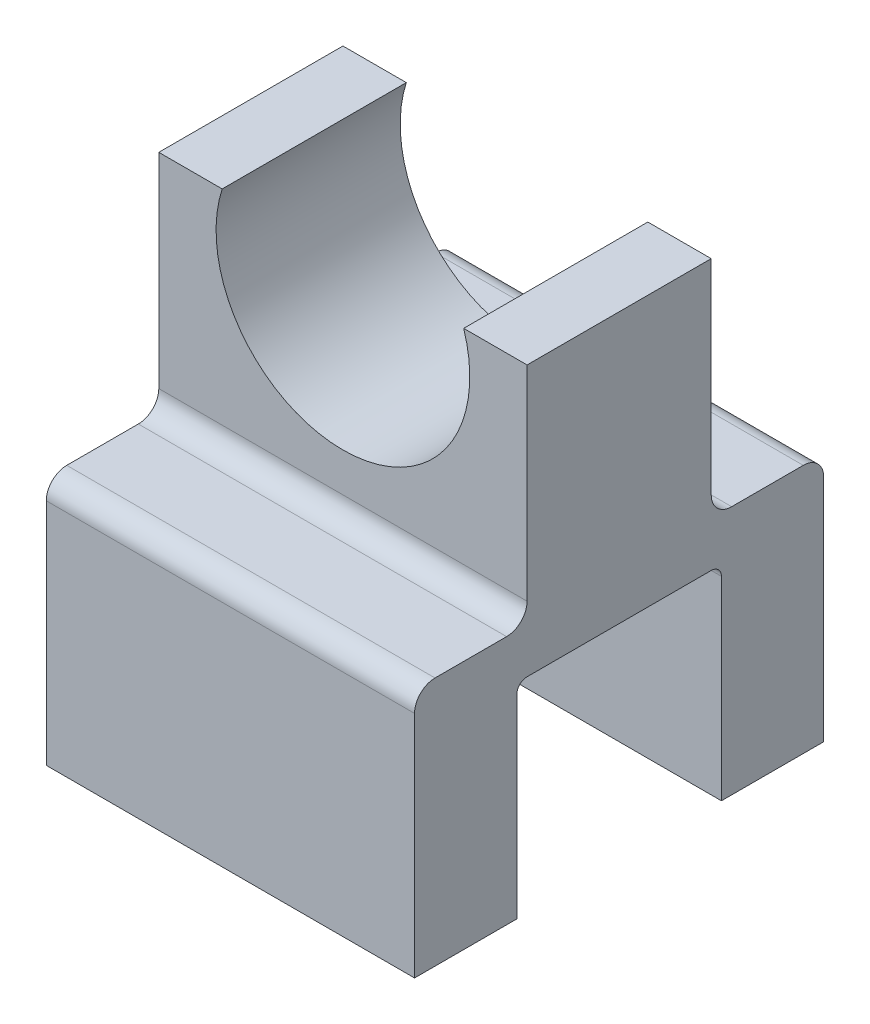
ISO-10303-21;
HEADER;
FILE_DESCRIPTION(('STEP AP214'),'2;1');
FILE_NAME('part.step','',(''),(''),'','','');
FILE_SCHEMA(('AUTOMOTIVE_DESIGN { 1 0 10303 214 1 1 1 1 }'));
ENDSEC;
DATA;
#1=APPLICATION_CONTEXT('core data for automotive mechanical design processes');
#2=APPLICATION_PROTOCOL_DEFINITION('international standard','automotive_design',2000,#1);
#3=PRODUCT_CONTEXT('',#1,'mechanical');
#4=PRODUCT('Part','Part','',(#3));
#5=PRODUCT_RELATED_PRODUCT_CATEGORY('part','',(#4));
#6=PRODUCT_DEFINITION_FORMATION('','',#4);
#7=PRODUCT_DEFINITION_CONTEXT('part definition',#1,'design');
#8=PRODUCT_DEFINITION('design','',#6,#7);
#9=PRODUCT_DEFINITION_SHAPE('','',#8);
#10=(LENGTH_UNIT() NAMED_UNIT(*) SI_UNIT(.MILLI.,.METRE.));
#11=(NAMED_UNIT(*) PLANE_ANGLE_UNIT() SI_UNIT($,.RADIAN.));
#12=(NAMED_UNIT(*) SI_UNIT($,.STERADIAN.) SOLID_ANGLE_UNIT());
#13=UNCERTAINTY_MEASURE_WITH_UNIT(LENGTH_MEASURE(1.E-05),#10,'distance_accuracy_value','');
#14=(GEOMETRIC_REPRESENTATION_CONTEXT(3) GLOBAL_UNCERTAINTY_ASSIGNED_CONTEXT((#13)) GLOBAL_UNIT_ASSIGNED_CONTEXT((#10,
#11,#12)) REPRESENTATION_CONTEXT('',''));
#15=CARTESIAN_POINT('',(0.,0.,0.));
#16=DIRECTION('',(0.,0.,1.));
#17=DIRECTION('',(1.,0.,0.));
#18=AXIS2_PLACEMENT_3D('',#15,#16,#17);
#19=CARTESIAN_POINT('',(0.,0.,50.8));
#20=DIRECTION('',(0.,1.,0.));
#21=DIRECTION('',(0.,0.,1.));
#22=AXIS2_PLACEMENT_3D('',#19,#20,#21);
#23=PLANE('',#22);
#24=DIRECTION('',(0.,0.,-1.));
#25=VECTOR('',#24,1.);
#26=CARTESIAN_POINT('',(0.,0.,50.8));
#27=LINE('',#26,#25);
#28=CARTESIAN_POINT('',(0.,0.,50.8));
#29=VERTEX_POINT('',#28);
#30=CARTESIAN_POINT('',(0.,0.,38.1));
#31=VERTEX_POINT('',#30);
#32=EDGE_CURVE('E216',#29,#31,#27,.T.);
#33=ORIENTED_EDGE('',*,*,#32,.T.);
#34=DIRECTION('',(1.,0.,0.));
#35=VECTOR('',#34,1.);
#36=CARTESIAN_POINT('',(0.,0.,38.1));
#37=LINE('',#36,#35);
#38=CARTESIAN_POINT('',(45.72,0.,38.1));
#39=VERTEX_POINT('',#38);
#40=EDGE_CURVE('E308',#31,#39,#37,.T.);
#41=ORIENTED_EDGE('',*,*,#40,.T.);
#42=DIRECTION('',(0.,0.,-1.));
#43=VECTOR('',#42,1.);
#44=CARTESIAN_POINT('',(45.72,0.,50.8));
#45=LINE('',#44,#43);
#46=CARTESIAN_POINT('',(45.72,0.,50.8));
#47=VERTEX_POINT('',#46);
#48=EDGE_CURVE('E208',#47,#39,#45,.T.);
#49=ORIENTED_EDGE('',*,*,#48,.F.);
#50=DIRECTION('',(1.,0.,0.));
#51=VECTOR('',#50,1.);
#52=CARTESIAN_POINT('',(0.,0.,50.8));
#53=LINE('',#52,#51);
#54=EDGE_CURVE('E322',#29,#47,#53,.T.);
#55=ORIENTED_EDGE('',*,*,#54,.F.);
#56=EDGE_LOOP('',(#33,#41,#49,#55));
#57=FACE_BOUND('',#56,.T.);
#58=ADVANCED_FACE('F42',(#57),#23,.F.);
#59=CARTESIAN_POINT('',(0.,0.,50.8));
#60=DIRECTION('',(1.,0.,0.));
#61=DIRECTION('',(0.,0.,-1.));
#62=AXIS2_PLACEMENT_3D('',#59,#60,#61);
#63=PLANE('',#62);
#64=DIRECTION('',(0.,0.,1.));
#65=VECTOR('',#64,1.);
#66=CARTESIAN_POINT('',(0.,30.988,0.));
#67=LINE('',#66,#65);
#68=CARTESIAN_POINT('',(0.,30.988,2.54));
#69=VERTEX_POINT('',#68);
#70=CARTESIAN_POINT('',(0.,30.988,11.43));
#71=VERTEX_POINT('',#70);
#72=EDGE_CURVE('E271',#69,#71,#67,.T.);
#73=ORIENTED_EDGE('',*,*,#72,.F.);
#74=CARTESIAN_POINT('',(0.,28.448,2.54));
#75=DIRECTION('',(1.,0.,0.));
#76=DIRECTION('',(0.,0.,-1.));
#77=AXIS2_PLACEMENT_3D('',#74,#75,#76);
#78=CIRCLE('',#77,2.54);
#79=CARTESIAN_POINT('',(0.,28.448,0.));
#80=VERTEX_POINT('',#79);
#81=EDGE_CURVE('E244',#69,#80,#78,.F.);
#82=ORIENTED_EDGE('',*,*,#81,.T.);
#83=DIRECTION('',(0.,-1.,0.));
#84=VECTOR('',#83,1.);
#85=CARTESIAN_POINT('',(0.,0.,0.));
#86=LINE('',#85,#84);
#87=CARTESIAN_POINT('',(0.,0.,0.));
#88=VERTEX_POINT('',#87);
#89=EDGE_CURVE('E317',#80,#88,#86,.T.);
#90=ORIENTED_EDGE('',*,*,#89,.T.);
#91=CARTESIAN_POINT('',(0.,0.,12.7));
#92=VERTEX_POINT('',#91);
#93=EDGE_CURVE('E215',#92,#88,#27,.T.);
#94=ORIENTED_EDGE('',*,*,#93,.F.);
#95=DIRECTION('',(0.,1.,0.));
#96=VECTOR('',#95,1.);
#97=CARTESIAN_POINT('',(0.,0.,12.7));
#98=LINE('',#97,#96);
#99=CARTESIAN_POINT('',(0.,24.13,12.7));
#100=VERTEX_POINT('',#99);
#101=EDGE_CURVE('E301',#92,#100,#98,.T.);
#102=ORIENTED_EDGE('',*,*,#101,.T.);
#103=CARTESIAN_POINT('',(0.,24.13,13.97));
#104=DIRECTION('',(1.,0.,0.));
#105=DIRECTION('',(0.,0.,-1.));
#106=AXIS2_PLACEMENT_3D('',#103,#104,#105);
#107=CIRCLE('',#106,1.27);
#108=CARTESIAN_POINT('',(0.,25.4,13.97));
#109=VERTEX_POINT('',#108);
#110=EDGE_CURVE('E235',#100,#109,#107,.T.);
#111=ORIENTED_EDGE('',*,*,#110,.T.);
#112=DIRECTION('',(0.,0.,1.));
#113=VECTOR('',#112,1.);
#114=CARTESIAN_POINT('',(0.,25.4,38.1));
#115=LINE('',#114,#113);
#116=CARTESIAN_POINT('',(0.,25.4,36.83));
#117=VERTEX_POINT('',#116);
#118=EDGE_CURVE('E305',#109,#117,#115,.T.);
#119=ORIENTED_EDGE('',*,*,#118,.T.);
#120=CARTESIAN_POINT('',(0.,24.13,36.83));
#121=DIRECTION('',(1.,0.,0.));
#122=DIRECTION('',(0.,0.,-1.));
#123=AXIS2_PLACEMENT_3D('',#120,#121,#122);
#124=CIRCLE('',#123,1.27);
#125=CARTESIAN_POINT('',(0.,24.13,38.1));
#126=VERTEX_POINT('',#125);
#127=EDGE_CURVE('E231',#117,#126,#124,.T.);
#128=ORIENTED_EDGE('',*,*,#127,.T.);
#129=DIRECTION('',(0.,-1.,0.));
#130=VECTOR('',#129,1.);
#131=CARTESIAN_POINT('',(0.,0.,38.1));
#132=LINE('',#131,#130);
#133=EDGE_CURVE('E299',#126,#31,#132,.T.);
#134=ORIENTED_EDGE('',*,*,#133,.T.);
#135=ORIENTED_EDGE('',*,*,#32,.F.);
#136=DIRECTION('',(0.,-1.,0.));
#137=VECTOR('',#136,1.);
#138=CARTESIAN_POINT('',(0.,0.,50.8));
#139=LINE('',#138,#137);
#140=CARTESIAN_POINT('',(0.,28.448,50.8));
#141=VERTEX_POINT('',#140);
#142=EDGE_CURVE('E320',#141,#29,#139,.T.);
#143=ORIENTED_EDGE('',*,*,#142,.F.);
#144=CARTESIAN_POINT('',(0.,28.448,48.26));
#145=DIRECTION('',(1.,0.,0.));
#146=DIRECTION('',(0.,0.,-1.));
#147=AXIS2_PLACEMENT_3D('',#144,#145,#146);
#148=CIRCLE('',#147,2.54);
#149=CARTESIAN_POINT('',(0.,30.988,48.26));
#150=VERTEX_POINT('',#149);
#151=EDGE_CURVE('E242',#141,#150,#148,.F.);
#152=ORIENTED_EDGE('',*,*,#151,.T.);
#153=DIRECTION('',(0.,0.,1.));
#154=VECTOR('',#153,1.);
#155=CARTESIAN_POINT('',(0.,30.988,50.8));
#156=LINE('',#155,#154);
#157=CARTESIAN_POINT('',(0.,30.988,39.37));
#158=VERTEX_POINT('',#157);
#159=EDGE_CURVE('E189',#158,#150,#156,.T.);
#160=ORIENTED_EDGE('',*,*,#159,.F.);
#161=CARTESIAN_POINT('',(0.,33.528,39.37));
#162=DIRECTION('',(1.,0.,0.));
#163=DIRECTION('',(0.,0.,-1.));
#164=AXIS2_PLACEMENT_3D('',#161,#162,#163);
#165=CIRCLE('',#164,2.54);
#166=CARTESIAN_POINT('',(0.,33.528,36.83));
#167=VERTEX_POINT('',#166);
#168=EDGE_CURVE('E263',#158,#167,#165,.T.);
#169=ORIENTED_EDGE('',*,*,#168,.T.);
#170=DIRECTION('',(0.,-1.,0.));
#171=VECTOR('',#170,1.);
#172=CARTESIAN_POINT('',(0.,58.928,36.83));
#173=LINE('',#172,#171);
#174=CARTESIAN_POINT('',(0.,58.928,36.83));
#175=VERTEX_POINT('',#174);
#176=EDGE_CURVE('E281',#175,#167,#173,.T.);
#177=ORIENTED_EDGE('',*,*,#176,.F.);
#178=DIRECTION('',(0.,0.,-1.));
#179=VECTOR('',#178,1.);
#180=CARTESIAN_POINT('',(0.,58.928,50.8));
#181=LINE('',#180,#179);
#182=CARTESIAN_POINT('',(0.,58.928,13.97));
#183=VERTEX_POINT('',#182);
#184=EDGE_CURVE('E327',#175,#183,#181,.T.);
#185=ORIENTED_EDGE('',*,*,#184,.T.);
#186=DIRECTION('',(0.,1.,0.));
#187=VECTOR('',#186,1.);
#188=CARTESIAN_POINT('',(0.,58.928,13.97));
#189=LINE('',#188,#187);
#190=CARTESIAN_POINT('',(0.,33.528,13.97));
#191=VERTEX_POINT('',#190);
#192=EDGE_CURVE('E273',#191,#183,#189,.T.);
#193=ORIENTED_EDGE('',*,*,#192,.F.);
#194=CARTESIAN_POINT('',(0.,33.528,11.43));
#195=DIRECTION('',(1.,0.,0.));
#196=DIRECTION('',(0.,0.,-1.));
#197=AXIS2_PLACEMENT_3D('',#194,#195,#196);
#198=CIRCLE('',#197,2.54);
#199=EDGE_CURVE('E50',#191,#71,#198,.T.);
#200=ORIENTED_EDGE('',*,*,#199,.T.);
#201=EDGE_LOOP('',(#73,#82,#90,#94,#102,#111,#119,#128,#134,#135,#143,#152,#160,#169,#177,#185,
#193,#200));
#202=FACE_BOUND('',#201,.T.);
#203=ADVANCED_FACE('F270',(#202),#63,.F.);
#204=CARTESIAN_POINT('',(45.72,0.,12.7));
#205=VERTEX_POINT('',#204);
#206=CARTESIAN_POINT('',(45.72,0.,0.));
#207=VERTEX_POINT('',#206);
#208=EDGE_CURVE('E206',#205,#207,#45,.T.);
#209=ORIENTED_EDGE('',*,*,#208,.F.);
#210=DIRECTION('',(1.,0.,0.));
#211=VECTOR('',#210,1.);
#212=CARTESIAN_POINT('',(0.,0.,12.7));
#213=LINE('',#212,#211);
#214=EDGE_CURVE('E315',#92,#205,#213,.T.);
#215=ORIENTED_EDGE('',*,*,#214,.F.);
#216=ORIENTED_EDGE('',*,*,#93,.T.);
#217=DIRECTION('',(1.,0.,0.));
#218=VECTOR('',#217,1.);
#219=CARTESIAN_POINT('',(0.,0.,0.));
#220=LINE('',#219,#218);
#221=EDGE_CURVE('E329',#88,#207,#220,.T.);
#222=ORIENTED_EDGE('',*,*,#221,.T.);
#223=EDGE_LOOP('',(#209,#215,#216,#222));
#224=FACE_BOUND('',#223,.T.);
#225=ADVANCED_FACE('F391',(#224),#23,.F.);
#226=CARTESIAN_POINT('',(45.72,0.,50.8));
#227=DIRECTION('',(-1.,0.,0.));
#228=DIRECTION('',(0.,0.,1.));
#229=AXIS2_PLACEMENT_3D('',#226,#227,#228);
#230=PLANE('',#229);
#231=DIRECTION('',(0.,1.,0.));
#232=VECTOR('',#231,1.);
#233=CARTESIAN_POINT('',(45.72,0.,0.));
#234=LINE('',#233,#232);
#235=CARTESIAN_POINT('',(45.72,28.448,0.));
#236=VERTEX_POINT('',#235);
#237=EDGE_CURVE('E323',#207,#236,#234,.T.);
#238=ORIENTED_EDGE('',*,*,#237,.T.);
#239=CARTESIAN_POINT('',(45.72,28.448,2.54));
#240=DIRECTION('',(-1.,0.,0.));
#241=DIRECTION('',(0.,0.,1.));
#242=AXIS2_PLACEMENT_3D('',#239,#240,#241);
#243=CIRCLE('',#242,2.54);
#244=CARTESIAN_POINT('',(45.72,30.988,2.54));
#245=VERTEX_POINT('',#244);
#246=EDGE_CURVE('E249',#236,#245,#243,.F.);
#247=ORIENTED_EDGE('',*,*,#246,.T.);
#248=DIRECTION('',(0.,0.,1.));
#249=VECTOR('',#248,1.);
#250=CARTESIAN_POINT('',(45.72,30.988,0.));
#251=LINE('',#250,#249);
#252=CARTESIAN_POINT('',(45.72,30.988,11.43));
#253=VERTEX_POINT('',#252);
#254=EDGE_CURVE('E287',#245,#253,#251,.T.);
#255=ORIENTED_EDGE('',*,*,#254,.T.);
#256=CARTESIAN_POINT('',(45.72,33.528,11.43));
#257=DIRECTION('',(-1.,0.,0.));
#258=DIRECTION('',(0.,0.,1.));
#259=AXIS2_PLACEMENT_3D('',#256,#257,#258);
#260=CIRCLE('',#259,2.54);
#261=CARTESIAN_POINT('',(45.72,33.528,13.97));
#262=VERTEX_POINT('',#261);
#263=EDGE_CURVE('E11',#253,#262,#260,.T.);
#264=ORIENTED_EDGE('',*,*,#263,.T.);
#265=DIRECTION('',(0.,1.,0.));
#266=VECTOR('',#265,1.);
#267=CARTESIAN_POINT('',(45.72,58.928,13.97));
#268=LINE('',#267,#266);
#269=CARTESIAN_POINT('',(45.72,58.928,13.97));
#270=VERTEX_POINT('',#269);
#271=EDGE_CURVE('E204',#262,#270,#268,.T.);
#272=ORIENTED_EDGE('',*,*,#271,.T.);
#273=DIRECTION('',(0.,0.,-1.));
#274=VECTOR('',#273,1.);
#275=CARTESIAN_POINT('',(45.72,58.928,50.8));
#276=LINE('',#275,#274);
#277=CARTESIAN_POINT('',(45.72,58.928,36.83));
#278=VERTEX_POINT('',#277);
#279=EDGE_CURVE('E196',#278,#270,#276,.T.);
#280=ORIENTED_EDGE('',*,*,#279,.F.);
#281=DIRECTION('',(0.,-1.,0.));
#282=VECTOR('',#281,1.);
#283=CARTESIAN_POINT('',(45.72,58.928,36.83));
#284=LINE('',#283,#282);
#285=CARTESIAN_POINT('',(45.72,33.528,36.83));
#286=VERTEX_POINT('',#285);
#287=EDGE_CURVE('E178',#278,#286,#284,.T.);
#288=ORIENTED_EDGE('',*,*,#287,.T.);
#289=CARTESIAN_POINT('',(45.72,33.528,39.37));
#290=DIRECTION('',(-1.,0.,0.));
#291=DIRECTION('',(0.,0.,1.));
#292=AXIS2_PLACEMENT_3D('',#289,#290,#291);
#293=CIRCLE('',#292,2.54);
#294=CARTESIAN_POINT('',(45.72,30.988,39.37));
#295=VERTEX_POINT('',#294);
#296=EDGE_CURVE('E265',#286,#295,#293,.T.);
#297=ORIENTED_EDGE('',*,*,#296,.T.);
#298=DIRECTION('',(0.,0.,1.));
#299=VECTOR('',#298,1.);
#300=CARTESIAN_POINT('',(45.72,30.988,50.8));
#301=LINE('',#300,#299);
#302=CARTESIAN_POINT('',(45.72,30.988,48.26));
#303=VERTEX_POINT('',#302);
#304=EDGE_CURVE('E188',#295,#303,#301,.T.);
#305=ORIENTED_EDGE('',*,*,#304,.T.);
#306=CARTESIAN_POINT('',(45.72,28.448,48.26));
#307=DIRECTION('',(-1.,0.,0.));
#308=DIRECTION('',(0.,0.,1.));
#309=AXIS2_PLACEMENT_3D('',#306,#307,#308);
#310=CIRCLE('',#309,2.54);
#311=CARTESIAN_POINT('',(45.72,28.448,50.8));
#312=VERTEX_POINT('',#311);
#313=EDGE_CURVE('E62',#303,#312,#310,.F.);
#314=ORIENTED_EDGE('',*,*,#313,.T.);
#315=DIRECTION('',(0.,1.,0.));
#316=VECTOR('',#315,1.);
#317=CARTESIAN_POINT('',(45.72,0.,50.8));
#318=LINE('',#317,#316);
#319=EDGE_CURVE('E325',#47,#312,#318,.T.);
#320=ORIENTED_EDGE('',*,*,#319,.F.);
#321=ORIENTED_EDGE('',*,*,#48,.T.);
#322=DIRECTION('',(0.,-1.,0.));
#323=VECTOR('',#322,1.);
#324=CARTESIAN_POINT('',(45.72,0.,38.1));
#325=LINE('',#324,#323);
#326=CARTESIAN_POINT('',(45.72,24.13,38.1));
#327=VERTEX_POINT('',#326);
#328=EDGE_CURVE('E298',#327,#39,#325,.T.);
#329=ORIENTED_EDGE('',*,*,#328,.F.);
#330=CARTESIAN_POINT('',(45.72,24.13,36.83));
#331=DIRECTION('',(-1.,0.,0.));
#332=DIRECTION('',(0.,0.,1.));
#333=AXIS2_PLACEMENT_3D('',#330,#331,#332);
#334=CIRCLE('',#333,1.27);
#335=CARTESIAN_POINT('',(45.72,25.4,36.83));
#336=VERTEX_POINT('',#335);
#337=EDGE_CURVE('E229',#327,#336,#334,.T.);
#338=ORIENTED_EDGE('',*,*,#337,.T.);
#339=DIRECTION('',(0.,0.,1.));
#340=VECTOR('',#339,1.);
#341=CARTESIAN_POINT('',(45.72,25.4,38.1));
#342=LINE('',#341,#340);
#343=CARTESIAN_POINT('',(45.72,25.4,13.97));
#344=VERTEX_POINT('',#343);
#345=EDGE_CURVE('E302',#344,#336,#342,.T.);
#346=ORIENTED_EDGE('',*,*,#345,.F.);
#347=CARTESIAN_POINT('',(45.72,24.13,13.97));
#348=DIRECTION('',(-1.,0.,0.));
#349=DIRECTION('',(0.,0.,1.));
#350=AXIS2_PLACEMENT_3D('',#347,#348,#349);
#351=CIRCLE('',#350,1.27);
#352=CARTESIAN_POINT('',(45.72,24.13,12.7));
#353=VERTEX_POINT('',#352);
#354=EDGE_CURVE('E233',#344,#353,#351,.T.);
#355=ORIENTED_EDGE('',*,*,#354,.T.);
#356=DIRECTION('',(0.,1.,0.));
#357=VECTOR('',#356,1.);
#358=CARTESIAN_POINT('',(45.72,0.,12.7));
#359=LINE('',#358,#357);
#360=EDGE_CURVE('E310',#205,#353,#359,.T.);
#361=ORIENTED_EDGE('',*,*,#360,.F.);
#362=ORIENTED_EDGE('',*,*,#208,.T.);
#363=EDGE_LOOP('',(#238,#247,#255,#264,#272,#280,#288,#297,#305,#314,#320,#321,#329,#338,#346,
#355,#361,#362));
#364=FACE_BOUND('',#363,.T.);
#365=ADVANCED_FACE('F203',(#364),#230,.F.);
#366=CARTESIAN_POINT('',(37.8503044665544,58.928,50.8));
#367=DIRECTION('',(0.,-1.,0.));
#368=DIRECTION('',(1.,0.,0.));
#369=AXIS2_PLACEMENT_3D('',#366,#367,#368);
#370=PLANE('',#369);
#371=DIRECTION('',(0.,0.,-1.));
#372=VECTOR('',#371,1.);
#373=CARTESIAN_POINT('',(37.8503044665544,58.928,50.8));
#374=LINE('',#373,#372);
#375=CARTESIAN_POINT('',(37.8503044665544,58.928,36.83));
#376=VERTEX_POINT('',#375);
#377=CARTESIAN_POINT('',(37.8503044665544,58.928,13.97));
#378=VERTEX_POINT('',#377);
#379=EDGE_CURVE('E198',#376,#378,#374,.T.);
#380=ORIENTED_EDGE('',*,*,#379,.F.);
#381=DIRECTION('',(-1.,0.,0.));
#382=VECTOR('',#381,1.);
#383=CARTESIAN_POINT('',(45.72,58.928,36.83));
#384=LINE('',#383,#382);
#385=EDGE_CURVE('E182',#278,#376,#384,.T.);
#386=ORIENTED_EDGE('',*,*,#385,.F.);
#387=ORIENTED_EDGE('',*,*,#279,.T.);
#388=DIRECTION('',(-1.,0.,0.));
#389=VECTOR('',#388,1.);
#390=CARTESIAN_POINT('',(45.72,58.928,13.97));
#391=LINE('',#390,#389);
#392=EDGE_CURVE('E286',#270,#378,#391,.T.);
#393=ORIENTED_EDGE('',*,*,#392,.T.);
#394=EDGE_LOOP('',(#380,#386,#387,#393));
#395=FACE_BOUND('',#394,.T.);
#396=ADVANCED_FACE('F194',(#395),#370,.F.);
#397=CARTESIAN_POINT('',(22.86,54.102,50.8));
#398=DIRECTION('',(0.,0.,-1.));
#399=DIRECTION('',(-1.,0.,0.));
#400=AXIS2_PLACEMENT_3D('',#397,#398,#399);
#401=CYLINDRICAL_SURFACE('',#400,15.748);
#402=DIRECTION('',(0.,0.,-1.));
#403=VECTOR('',#402,1.);
#404=CARTESIAN_POINT('',(7.86969553344563,58.928,50.8));
#405=LINE('',#404,#403);
#406=CARTESIAN_POINT('',(7.86969553344563,58.928,36.83));
#407=VERTEX_POINT('',#406);
#408=CARTESIAN_POINT('',(7.86969553344563,58.928,13.97));
#409=VERTEX_POINT('',#408);
#410=EDGE_CURVE('E210',#407,#409,#405,.T.);
#411=ORIENTED_EDGE('',*,*,#410,.F.);
#412=CARTESIAN_POINT('',(22.86,54.102,36.83));
#413=DIRECTION('',(0.,0.,-1.));
#414=DIRECTION('',(-1.,0.,0.));
#415=AXIS2_PLACEMENT_3D('',#412,#413,#414);
#416=CIRCLE('',#415,15.748);
#417=EDGE_CURVE('E296',#407,#376,#416,.F.);
#418=ORIENTED_EDGE('',*,*,#417,.T.);
#419=ORIENTED_EDGE('',*,*,#379,.T.);
#420=CARTESIAN_POINT('',(22.86,54.102,13.97));
#421=DIRECTION('',(0.,0.,1.));
#422=DIRECTION('',(0.,-1.,0.));
#423=AXIS2_PLACEMENT_3D('',#420,#421,#422);
#424=CIRCLE('',#423,15.748);
#425=EDGE_CURVE('E199',#378,#409,#424,.F.);
#426=ORIENTED_EDGE('',*,*,#425,.T.);
#427=EDGE_LOOP('',(#411,#418,#419,#426));
#428=FACE_BOUND('',#427,.T.);
#429=ADVANCED_FACE('F340',(#428),#401,.F.);
#430=CARTESIAN_POINT('',(0.,58.928,50.8));
#431=DIRECTION('',(0.,-1.,0.));
#432=DIRECTION('',(1.,0.,0.));
#433=AXIS2_PLACEMENT_3D('',#430,#431,#432);
#434=PLANE('',#433);
#435=ORIENTED_EDGE('',*,*,#184,.F.);
#436=EDGE_CURVE('E200',#407,#175,#384,.T.);
#437=ORIENTED_EDGE('',*,*,#436,.F.);
#438=ORIENTED_EDGE('',*,*,#410,.T.);
#439=EDGE_CURVE('E290',#409,#183,#391,.T.);
#440=ORIENTED_EDGE('',*,*,#439,.T.);
#441=EDGE_LOOP('',(#435,#437,#438,#440));
#442=FACE_BOUND('',#441,.T.);
#443=ADVANCED_FACE('F338',(#442),#434,.F.);
#444=CARTESIAN_POINT('',(22.86,54.102,50.8));
#445=DIRECTION('',(0.,0.,1.));
#446=DIRECTION('',(1.,0.,0.));
#447=AXIS2_PLACEMENT_3D('',#444,#445,#446);
#448=PLANE('',#447);
#449=ORIENTED_EDGE('',*,*,#319,.T.);
#450=DIRECTION('',(-1.,0.,0.));
#451=VECTOR('',#450,1.);
#452=CARTESIAN_POINT('',(0.,28.448,50.8));
#453=LINE('',#452,#451);
#454=EDGE_CURVE('E251',#312,#141,#453,.T.);
#455=ORIENTED_EDGE('',*,*,#454,.T.);
#456=ORIENTED_EDGE('',*,*,#142,.T.);
#457=ORIENTED_EDGE('',*,*,#54,.T.);
#458=EDGE_LOOP('',(#449,#455,#456,#457));
#459=FACE_BOUND('',#458,.T.);
#460=ADVANCED_FACE('F359',(#459),#448,.T.);
#461=CARTESIAN_POINT('',(22.86,54.102,0.));
#462=DIRECTION('',(0.,0.,1.));
#463=DIRECTION('',(1.,0.,0.));
#464=AXIS2_PLACEMENT_3D('',#461,#462,#463);
#465=PLANE('',#464);
#466=ORIENTED_EDGE('',*,*,#89,.F.);
#467=DIRECTION('',(-1.,0.,0.));
#468=VECTOR('',#467,1.);
#469=CARTESIAN_POINT('',(22.86,28.448,0.));
#470=LINE('',#469,#468);
#471=EDGE_CURVE('E246',#80,#236,#470,.F.);
#472=ORIENTED_EDGE('',*,*,#471,.T.);
#473=ORIENTED_EDGE('',*,*,#237,.F.);
#474=ORIENTED_EDGE('',*,*,#221,.F.);
#475=EDGE_LOOP('',(#466,#472,#473,#474));
#476=FACE_BOUND('',#475,.T.);
#477=ADVANCED_FACE('F396',(#476),#465,.F.);
#478=CARTESIAN_POINT('',(0.,0.,38.1));
#479=DIRECTION('',(0.,0.,1.));
#480=DIRECTION('',(1.,0.,0.));
#481=AXIS2_PLACEMENT_3D('',#478,#479,#480);
#482=PLANE('',#481);
#483=ORIENTED_EDGE('',*,*,#133,.F.);
#484=DIRECTION('',(1.,0.,0.));
#485=VECTOR('',#484,1.);
#486=CARTESIAN_POINT('',(45.72,24.13,38.1));
#487=LINE('',#486,#485);
#488=EDGE_CURVE('E219',#126,#327,#487,.T.);
#489=ORIENTED_EDGE('',*,*,#488,.T.);
#490=ORIENTED_EDGE('',*,*,#328,.T.);
#491=ORIENTED_EDGE('',*,*,#40,.F.);
#492=EDGE_LOOP('',(#483,#489,#490,#491));
#493=FACE_BOUND('',#492,.T.);
#494=ADVANCED_FACE('F369',(#493),#482,.F.);
#495=CARTESIAN_POINT('',(0.,25.4,38.1));
#496=DIRECTION('',(0.,1.,0.));
#497=DIRECTION('',(0.,0.,1.));
#498=AXIS2_PLACEMENT_3D('',#495,#496,#497);
#499=PLANE('',#498);
#500=ORIENTED_EDGE('',*,*,#345,.T.);
#501=DIRECTION('',(1.,0.,0.));
#502=VECTOR('',#501,1.);
#503=CARTESIAN_POINT('',(0.,25.4,36.83));
#504=LINE('',#503,#502);
#505=EDGE_CURVE('E225',#336,#117,#504,.F.);
#506=ORIENTED_EDGE('',*,*,#505,.T.);
#507=ORIENTED_EDGE('',*,*,#118,.F.);
#508=DIRECTION('',(1.,0.,0.));
#509=VECTOR('',#508,1.);
#510=CARTESIAN_POINT('',(45.72,25.4,13.97));
#511=LINE('',#510,#509);
#512=EDGE_CURVE('E222',#109,#344,#511,.T.);
#513=ORIENTED_EDGE('',*,*,#512,.T.);
#514=EDGE_LOOP('',(#500,#506,#507,#513));
#515=FACE_BOUND('',#514,.T.);
#516=ADVANCED_FACE('F377',(#515),#499,.F.);
#517=CARTESIAN_POINT('',(0.,0.,12.7));
#518=DIRECTION('',(0.,0.,-1.));
#519=DIRECTION('',(-1.,0.,0.));
#520=AXIS2_PLACEMENT_3D('',#517,#518,#519);
#521=PLANE('',#520);
#522=ORIENTED_EDGE('',*,*,#360,.T.);
#523=DIRECTION('',(1.,0.,0.));
#524=VECTOR('',#523,1.);
#525=CARTESIAN_POINT('',(0.,24.13,12.7));
#526=LINE('',#525,#524);
#527=EDGE_CURVE('E227',#353,#100,#526,.F.);
#528=ORIENTED_EDGE('',*,*,#527,.T.);
#529=ORIENTED_EDGE('',*,*,#101,.F.);
#530=ORIENTED_EDGE('',*,*,#214,.T.);
#531=EDGE_LOOP('',(#522,#528,#529,#530));
#532=FACE_BOUND('',#531,.T.);
#533=ADVANCED_FACE('F387',(#532),#521,.F.);
#534=CARTESIAN_POINT('',(0.,24.13,36.83));
#535=DIRECTION('',(-1.,0.,0.));
#536=DIRECTION('',(0.,0.,1.));
#537=AXIS2_PLACEMENT_3D('',#534,#535,#536);
#538=CYLINDRICAL_SURFACE('',#537,1.27);
#539=ORIENTED_EDGE('',*,*,#127,.F.);
#540=ORIENTED_EDGE('',*,*,#505,.F.);
#541=ORIENTED_EDGE('',*,*,#337,.F.);
#542=ORIENTED_EDGE('',*,*,#488,.F.);
#543=EDGE_LOOP('',(#539,#540,#541,#542));
#544=FACE_BOUND('',#543,.T.);
#545=ADVANCED_FACE('F373',(#544),#538,.F.);
#546=CARTESIAN_POINT('',(0.,24.13,13.97));
#547=DIRECTION('',(-1.,0.,0.));
#548=DIRECTION('',(0.,0.,1.));
#549=AXIS2_PLACEMENT_3D('',#546,#547,#548);
#550=CYLINDRICAL_SURFACE('',#549,1.27);
#551=ORIENTED_EDGE('',*,*,#110,.F.);
#552=ORIENTED_EDGE('',*,*,#527,.F.);
#553=ORIENTED_EDGE('',*,*,#354,.F.);
#554=ORIENTED_EDGE('',*,*,#512,.F.);
#555=EDGE_LOOP('',(#551,#552,#553,#554));
#556=FACE_BOUND('',#555,.T.);
#557=ADVANCED_FACE('F383',(#556),#550,.F.);
#558=CARTESIAN_POINT('',(45.72,58.928,13.97));
#559=DIRECTION('',(0.,0.,1.));
#560=DIRECTION('',(0.,-1.,0.));
#561=AXIS2_PLACEMENT_3D('',#558,#559,#560);
#562=PLANE('',#561);
#563=ORIENTED_EDGE('',*,*,#271,.F.);
#564=DIRECTION('',(-1.,0.,0.));
#565=VECTOR('',#564,1.);
#566=CARTESIAN_POINT('',(0.,33.528,13.97));
#567=LINE('',#566,#565);
#568=EDGE_CURVE('E260',#262,#191,#567,.T.);
#569=ORIENTED_EDGE('',*,*,#568,.T.);
#570=ORIENTED_EDGE('',*,*,#192,.T.);
#571=ORIENTED_EDGE('',*,*,#439,.F.);
#572=ORIENTED_EDGE('',*,*,#425,.F.);
#573=ORIENTED_EDGE('',*,*,#392,.F.);
#574=EDGE_LOOP('',(#563,#569,#570,#571,#572,#573));
#575=FACE_BOUND('',#574,.T.);
#576=ADVANCED_FACE('F284',(#575),#562,.F.);
#577=CARTESIAN_POINT('',(45.72,30.988,0.));
#578=DIRECTION('',(0.,-1.,0.));
#579=DIRECTION('',(0.,0.,-1.));
#580=AXIS2_PLACEMENT_3D('',#577,#578,#579);
#581=PLANE('',#580);
#582=ORIENTED_EDGE('',*,*,#254,.F.);
#583=DIRECTION('',(-1.,0.,0.));
#584=VECTOR('',#583,1.);
#585=CARTESIAN_POINT('',(45.72,30.988,2.54));
#586=LINE('',#585,#584);
#587=EDGE_CURVE('E239',#245,#69,#586,.T.);
#588=ORIENTED_EDGE('',*,*,#587,.T.);
#589=ORIENTED_EDGE('',*,*,#72,.T.);
#590=DIRECTION('',(-1.,0.,0.));
#591=VECTOR('',#590,1.);
#592=CARTESIAN_POINT('',(45.72,30.988,11.43));
#593=LINE('',#592,#591);
#594=EDGE_CURVE('E237',#71,#253,#593,.F.);
#595=ORIENTED_EDGE('',*,*,#594,.T.);
#596=EDGE_LOOP('',(#582,#588,#589,#595));
#597=FACE_BOUND('',#596,.T.);
#598=ADVANCED_FACE('F279',(#597),#581,.F.);
#599=CARTESIAN_POINT('',(45.72,58.928,36.83));
#600=DIRECTION('',(0.,0.,-1.));
#601=DIRECTION('',(-1.,0.,0.));
#602=AXIS2_PLACEMENT_3D('',#599,#600,#601);
#603=PLANE('',#602);
#604=ORIENTED_EDGE('',*,*,#176,.T.);
#605=DIRECTION('',(-1.,0.,0.));
#606=VECTOR('',#605,1.);
#607=CARTESIAN_POINT('',(45.72,33.528,36.83));
#608=LINE('',#607,#606);
#609=EDGE_CURVE('E185',#167,#286,#608,.F.);
#610=ORIENTED_EDGE('',*,*,#609,.T.);
#611=ORIENTED_EDGE('',*,*,#287,.F.);
#612=ORIENTED_EDGE('',*,*,#385,.T.);
#613=ORIENTED_EDGE('',*,*,#417,.F.);
#614=ORIENTED_EDGE('',*,*,#436,.T.);
#615=EDGE_LOOP('',(#604,#610,#611,#612,#613,#614));
#616=FACE_BOUND('',#615,.T.);
#617=ADVANCED_FACE('F181',(#616),#603,.F.);
#618=CARTESIAN_POINT('',(45.72,30.988,50.8));
#619=DIRECTION('',(0.,-1.,0.));
#620=DIRECTION('',(0.,0.,-1.));
#621=AXIS2_PLACEMENT_3D('',#618,#619,#620);
#622=PLANE('',#621);
#623=ORIENTED_EDGE('',*,*,#159,.T.);
#624=DIRECTION('',(-1.,0.,0.));
#625=VECTOR('',#624,1.);
#626=CARTESIAN_POINT('',(45.72,30.988,48.26));
#627=LINE('',#626,#625);
#628=EDGE_CURVE('E257',#150,#303,#627,.F.);
#629=ORIENTED_EDGE('',*,*,#628,.T.);
#630=ORIENTED_EDGE('',*,*,#304,.F.);
#631=DIRECTION('',(-1.,0.,0.));
#632=VECTOR('',#631,1.);
#633=CARTESIAN_POINT('',(0.,30.988,39.37));
#634=LINE('',#633,#632);
#635=EDGE_CURVE('E254',#295,#158,#634,.T.);
#636=ORIENTED_EDGE('',*,*,#635,.T.);
#637=EDGE_LOOP('',(#623,#629,#630,#636));
#638=FACE_BOUND('',#637,.T.);
#639=ADVANCED_FACE('F352',(#638),#622,.F.);
#640=CARTESIAN_POINT('',(45.72,28.448,2.54));
#641=DIRECTION('',(-1.,0.,0.));
#642=DIRECTION('',(0.,0.,1.));
#643=AXIS2_PLACEMENT_3D('',#640,#641,#642);
#644=CYLINDRICAL_SURFACE('',#643,2.54);
#645=ORIENTED_EDGE('',*,*,#246,.F.);
#646=ORIENTED_EDGE('',*,*,#471,.F.);
#647=ORIENTED_EDGE('',*,*,#81,.F.);
#648=ORIENTED_EDGE('',*,*,#587,.F.);
#649=EDGE_LOOP('',(#645,#646,#647,#648));
#650=FACE_BOUND('',#649,.T.);
#651=ADVANCED_FACE('F400',(#650),#644,.T.);
#652=CARTESIAN_POINT('',(22.86,28.448,48.26));
#653=DIRECTION('',(1.,0.,0.));
#654=DIRECTION('',(0.,0.,-1.));
#655=AXIS2_PLACEMENT_3D('',#652,#653,#654);
#656=CYLINDRICAL_SURFACE('',#655,2.54);
#657=ORIENTED_EDGE('',*,*,#313,.F.);
#658=ORIENTED_EDGE('',*,*,#628,.F.);
#659=ORIENTED_EDGE('',*,*,#151,.F.);
#660=ORIENTED_EDGE('',*,*,#454,.F.);
#661=EDGE_LOOP('',(#657,#658,#659,#660));
#662=FACE_BOUND('',#661,.T.);
#663=ADVANCED_FACE('F355',(#662),#656,.T.);
#664=CARTESIAN_POINT('',(45.72,33.528,39.37));
#665=DIRECTION('',(1.,0.,0.));
#666=DIRECTION('',(0.,0.,-1.));
#667=AXIS2_PLACEMENT_3D('',#664,#665,#666);
#668=CYLINDRICAL_SURFACE('',#667,2.54);
#669=ORIENTED_EDGE('',*,*,#296,.F.);
#670=ORIENTED_EDGE('',*,*,#609,.F.);
#671=ORIENTED_EDGE('',*,*,#168,.F.);
#672=ORIENTED_EDGE('',*,*,#635,.F.);
#673=EDGE_LOOP('',(#669,#670,#671,#672));
#674=FACE_BOUND('',#673,.T.);
#675=ADVANCED_FACE('F350',(#674),#668,.F.);
#676=CARTESIAN_POINT('',(45.72,33.528,11.43));
#677=DIRECTION('',(1.,0.,0.));
#678=DIRECTION('',(0.,0.,-1.));
#679=AXIS2_PLACEMENT_3D('',#676,#677,#678);
#680=CYLINDRICAL_SURFACE('',#679,2.54);
#681=ORIENTED_EDGE('',*,*,#263,.F.);
#682=ORIENTED_EDGE('',*,*,#594,.F.);
#683=ORIENTED_EDGE('',*,*,#199,.F.);
#684=ORIENTED_EDGE('',*,*,#568,.F.);
#685=EDGE_LOOP('',(#681,#682,#683,#684));
#686=FACE_BOUND('',#685,.T.);
#687=ADVANCED_FACE('F44',(#686),#680,.F.);
#688=CLOSED_SHELL('',(#58,#203,#225,#365,#396,#429,#443,#460,#477,#494,#516,#533,#545,#557,#576,
#598,#617,#639,#651,#663,#675,#687));
#689=MANIFOLD_SOLID_BREP('B2',#688);
#690=ADVANCED_BREP_SHAPE_REPRESENTATION('',(#18,#689),#14);
#691=SHAPE_DEFINITION_REPRESENTATION(#9,#690);
ENDSEC;
END-ISO-10303-21;
